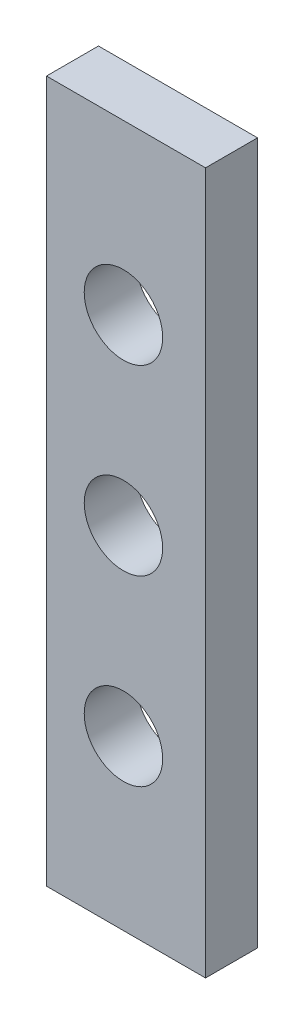
ISO-10303-21;
HEADER;
FILE_DESCRIPTION(('STEP AP214'),'2;1');
FILE_NAME('part.step','',(''),(''),'','','');
FILE_SCHEMA(('AUTOMOTIVE_DESIGN { 1 0 10303 214 1 1 1 1 }'));
ENDSEC;
DATA;
#1=APPLICATION_CONTEXT('core data for automotive mechanical design processes');
#2=APPLICATION_PROTOCOL_DEFINITION('international standard','automotive_design',2000,#1);
#3=PRODUCT_CONTEXT('',#1,'mechanical');
#4=PRODUCT('Part','Part','',(#3));
#5=PRODUCT_RELATED_PRODUCT_CATEGORY('part','',(#4));
#6=PRODUCT_DEFINITION_FORMATION('','',#4);
#7=PRODUCT_DEFINITION_CONTEXT('part definition',#1,'design');
#8=PRODUCT_DEFINITION('design','',#6,#7);
#9=PRODUCT_DEFINITION_SHAPE('','',#8);
#10=(LENGTH_UNIT() NAMED_UNIT(*) SI_UNIT(.MILLI.,.METRE.));
#11=(NAMED_UNIT(*) PLANE_ANGLE_UNIT() SI_UNIT($,.RADIAN.));
#12=(NAMED_UNIT(*) SI_UNIT($,.STERADIAN.) SOLID_ANGLE_UNIT());
#13=UNCERTAINTY_MEASURE_WITH_UNIT(LENGTH_MEASURE(1.E-05),#10,'distance_accuracy_value','');
#14=(GEOMETRIC_REPRESENTATION_CONTEXT(3) GLOBAL_UNCERTAINTY_ASSIGNED_CONTEXT((#13)) GLOBAL_UNIT_ASSIGNED_CONTEXT((#10,
#11,#12)) REPRESENTATION_CONTEXT('',''));
#15=CARTESIAN_POINT('',(0.,0.,0.));
#16=DIRECTION('',(0.,0.,1.));
#17=DIRECTION('',(1.,0.,0.));
#18=AXIS2_PLACEMENT_3D('',#15,#16,#17);
#19=CARTESIAN_POINT('',(-130.,-105.,-42.4383510177094));
#20=DIRECTION('',(1.,0.,0.));
#21=DIRECTION('',(0.,0.,1.));
#22=AXIS2_PLACEMENT_3D('',#19,#20,#21);
#23=PLANE('',#22);
#24=DIRECTION('',(0.,-1.,0.));
#25=VECTOR('',#24,1.);
#26=CARTESIAN_POINT('',(-130.,-105.,-2.85000000128499));
#27=LINE('',#26,#25);
#28=CARTESIAN_POINT('',(-130.,-66.5373864405591,-2.85000000128499));
#29=VERTEX_POINT('',#28);
#30=CARTESIAN_POINT('',(-130.,-105.,-2.85000000128499));
#31=VERTEX_POINT('',#30);
#32=EDGE_CURVE('E109',#29,#31,#27,.T.);
#33=ORIENTED_EDGE('',*,*,#32,.T.);
#34=DIRECTION('',(0.,0.,1.));
#35=VECTOR('',#34,1.);
#36=CARTESIAN_POINT('',(-130.,-105.,-42.4383510177094));
#37=LINE('',#36,#35);
#38=CARTESIAN_POINT('',(-130.,-105.,0.));
#39=VERTEX_POINT('',#38);
#40=EDGE_CURVE('E102',#31,#39,#37,.T.);
#41=ORIENTED_EDGE('',*,*,#40,.T.);
#42=DIRECTION('',(0.,-1.,0.));
#43=VECTOR('',#42,1.);
#44=CARTESIAN_POINT('',(-130.,-105.,0.));
#45=LINE('',#44,#43);
#46=CARTESIAN_POINT('',(-130.,-66.5373864405591,0.));
#47=VERTEX_POINT('',#46);
#48=EDGE_CURVE('E90',#47,#39,#45,.T.);
#49=ORIENTED_EDGE('',*,*,#48,.F.);
#50=DIRECTION('',(0.,0.,1.));
#51=VECTOR('',#50,1.);
#52=CARTESIAN_POINT('',(-130.,-66.5373864405591,-42.4383510177094));
#53=LINE('',#52,#51);
#54=EDGE_CURVE('E96',#29,#47,#53,.T.);
#55=ORIENTED_EDGE('',*,*,#54,.F.);
#56=EDGE_LOOP('',(#33,#41,#49,#55));
#57=FACE_BOUND('',#56,.T.);
#58=ADVANCED_FACE('F39',(#57),#23,.F.);
#59=CARTESIAN_POINT('',(-130.,-105.,-42.4383510177094));
#60=DIRECTION('',(0.,1.,0.));
#61=DIRECTION('',(-1.,0.,0.));
#62=AXIS2_PLACEMENT_3D('',#59,#60,#61);
#63=PLANE('',#62);
#64=DIRECTION('',(1.,0.,0.));
#65=VECTOR('',#64,1.);
#66=CARTESIAN_POINT('',(-130.,-105.,-2.85000000128499));
#67=LINE('',#66,#65);
#68=CARTESIAN_POINT('',(-121.281577604188,-105.,-2.85000000128499));
#69=VERTEX_POINT('',#68);
#70=EDGE_CURVE('E48',#31,#69,#67,.T.);
#71=ORIENTED_EDGE('',*,*,#70,.T.);
#72=DIRECTION('',(0.,0.,1.));
#73=VECTOR('',#72,1.);
#74=CARTESIAN_POINT('',(-121.281577604188,-105.,-42.4383510177094));
#75=LINE('',#74,#73);
#76=CARTESIAN_POINT('',(-121.281577604188,-105.,0.));
#77=VERTEX_POINT('',#76);
#78=EDGE_CURVE('E112',#69,#77,#75,.T.);
#79=ORIENTED_EDGE('',*,*,#78,.T.);
#80=DIRECTION('',(1.,0.,0.));
#81=VECTOR('',#80,1.);
#82=CARTESIAN_POINT('',(-130.,-105.,0.));
#83=LINE('',#82,#81);
#84=EDGE_CURVE('E79',#39,#77,#83,.T.);
#85=ORIENTED_EDGE('',*,*,#84,.F.);
#86=ORIENTED_EDGE('',*,*,#40,.F.);
#87=EDGE_LOOP('',(#71,#79,#85,#86));
#88=FACE_BOUND('',#87,.T.);
#89=ADVANCED_FACE('F146',(#88),#63,.F.);
#90=CARTESIAN_POINT('',(-121.281577604188,-105.,-42.4383510177094));
#91=DIRECTION('',(-1.,0.,0.));
#92=DIRECTION('',(0.,-1.,0.));
#93=AXIS2_PLACEMENT_3D('',#90,#91,#92);
#94=PLANE('',#93);
#95=DIRECTION('',(0.,1.,0.));
#96=VECTOR('',#95,1.);
#97=CARTESIAN_POINT('',(-121.281577604188,-105.,-2.85000000128499));
#98=LINE('',#97,#96);
#99=CARTESIAN_POINT('',(-121.281577604188,-66.5373864405591,-2.85000000128499));
#100=VERTEX_POINT('',#99);
#101=EDGE_CURVE('E11',#69,#100,#98,.T.);
#102=ORIENTED_EDGE('',*,*,#101,.T.);
#103=DIRECTION('',(0.,0.,1.));
#104=VECTOR('',#103,1.);
#105=CARTESIAN_POINT('',(-121.281577604188,-66.5373864405591,-42.4383510177094));
#106=LINE('',#105,#104);
#107=CARTESIAN_POINT('',(-121.281577604188,-66.5373864405591,0.));
#108=VERTEX_POINT('',#107);
#109=EDGE_CURVE('E94',#100,#108,#106,.T.);
#110=ORIENTED_EDGE('',*,*,#109,.T.);
#111=DIRECTION('',(0.,1.,0.));
#112=VECTOR('',#111,1.);
#113=CARTESIAN_POINT('',(-121.281577604188,-105.,0.));
#114=LINE('',#113,#112);
#115=EDGE_CURVE('E92',#77,#108,#114,.T.);
#116=ORIENTED_EDGE('',*,*,#115,.F.);
#117=ORIENTED_EDGE('',*,*,#78,.F.);
#118=EDGE_LOOP('',(#102,#110,#116,#117));
#119=FACE_BOUND('',#118,.T.);
#120=ADVANCED_FACE('F145',(#119),#94,.F.);
#121=CARTESIAN_POINT('',(-130.,-66.5373864405591,-42.4383510177094));
#122=DIRECTION('',(0.,-1.,0.));
#123=DIRECTION('',(0.,0.,1.));
#124=AXIS2_PLACEMENT_3D('',#121,#122,#123);
#125=PLANE('',#124);
#126=DIRECTION('',(-1.,0.,0.));
#127=VECTOR('',#126,1.);
#128=CARTESIAN_POINT('',(-130.,-66.5373864405591,-2.85000000128499));
#129=LINE('',#128,#127);
#130=EDGE_CURVE('E56',#100,#29,#129,.T.);
#131=ORIENTED_EDGE('',*,*,#130,.T.);
#132=ORIENTED_EDGE('',*,*,#54,.T.);
#133=DIRECTION('',(-1.,0.,0.));
#134=VECTOR('',#133,1.);
#135=CARTESIAN_POINT('',(-130.,-66.5373864405591,0.));
#136=LINE('',#135,#134);
#137=EDGE_CURVE('E62',#108,#47,#136,.T.);
#138=ORIENTED_EDGE('',*,*,#137,.F.);
#139=ORIENTED_EDGE('',*,*,#109,.F.);
#140=EDGE_LOOP('',(#131,#132,#138,#139));
#141=FACE_BOUND('',#140,.T.);
#142=ADVANCED_FACE('F97',(#141),#125,.F.);
#143=CARTESIAN_POINT('',(0.,0.,0.));
#144=DIRECTION('',(0.,0.,1.));
#145=DIRECTION('',(-1.,0.,0.));
#146=AXIS2_PLACEMENT_3D('',#143,#144,#145);
#147=PLANE('',#146);
#148=CARTESIAN_POINT('',(-125.781577604187,-95.7686932202796,0.));
#149=DIRECTION('',(0.,0.,-1.));
#150=DIRECTION('',(-1.,0.,0.));
#151=AXIS2_PLACEMENT_3D('',#148,#149,#150);
#152=CIRCLE('',#151,2.15);
#153=CARTESIAN_POINT('',(-127.931577604187,-95.7686932202796,0.));
#154=VERTEX_POINT('',#153);
#155=EDGE_CURVE('E43',#154,#154,#152,.T.);
#156=ORIENTED_EDGE('',*,*,#155,.T.);
#157=EDGE_LOOP('',(#156));
#158=FACE_BOUND('',#157,.T.);
#159=CARTESIAN_POINT('',(-125.781577604187,-85.7686932202796,0.));
#160=DIRECTION('',(0.,0.,-1.));
#161=DIRECTION('',(-1.,0.,0.));
#162=AXIS2_PLACEMENT_3D('',#159,#160,#161);
#163=CIRCLE('',#162,2.15);
#164=CARTESIAN_POINT('',(-127.931577604187,-85.7686932202796,0.));
#165=VERTEX_POINT('',#164);
#166=EDGE_CURVE('E117',#165,#165,#163,.T.);
#167=ORIENTED_EDGE('',*,*,#166,.T.);
#168=EDGE_LOOP('',(#167));
#169=FACE_BOUND('',#168,.T.);
#170=CARTESIAN_POINT('',(-125.781577604187,-75.7686932202796,0.));
#171=DIRECTION('',(0.,0.,-1.));
#172=DIRECTION('',(-1.,0.,0.));
#173=AXIS2_PLACEMENT_3D('',#170,#171,#172);
#174=CIRCLE('',#173,2.15);
#175=CARTESIAN_POINT('',(-127.931577604187,-75.7686932202796,0.));
#176=VERTEX_POINT('',#175);
#177=EDGE_CURVE('E100',#176,#176,#174,.T.);
#178=ORIENTED_EDGE('',*,*,#177,.T.);
#179=EDGE_LOOP('',(#178));
#180=FACE_BOUND('',#179,.T.);
#181=ORIENTED_EDGE('',*,*,#48,.T.);
#182=ORIENTED_EDGE('',*,*,#84,.T.);
#183=ORIENTED_EDGE('',*,*,#115,.T.);
#184=ORIENTED_EDGE('',*,*,#137,.T.);
#185=EDGE_LOOP('',(#181,#182,#183,#184));
#186=FACE_BOUND('',#185,.T.);
#187=ADVANCED_FACE('F88',(#158,#169,#180,#186),#147,.T.);
#188=CARTESIAN_POINT('',(-98.0000000000002,121.642872631566,-2.850000001285));
#189=DIRECTION('',(0.,0.,-1.));
#190=DIRECTION('',(1.,0.,0.));
#191=AXIS2_PLACEMENT_3D('',#188,#189,#190);
#192=PLANE('',#191);
#193=CARTESIAN_POINT('',(-125.781577604187,-95.7686932202796,-2.85000000128499));
#194=DIRECTION('',(0.,0.,1.));
#195=DIRECTION('',(1.,0.,0.));
#196=AXIS2_PLACEMENT_3D('',#193,#194,#195);
#197=CIRCLE('',#196,2.15);
#198=CARTESIAN_POINT('',(-123.631577604187,-95.7686932202796,-2.85000000128499));
#199=VERTEX_POINT('',#198);
#200=EDGE_CURVE('E120',#199,#199,#197,.T.);
#201=ORIENTED_EDGE('',*,*,#200,.T.);
#202=EDGE_LOOP('',(#201));
#203=FACE_BOUND('',#202,.T.);
#204=CARTESIAN_POINT('',(-125.781577604187,-85.7686932202796,-2.85000000128499));
#205=DIRECTION('',(0.,0.,1.));
#206=DIRECTION('',(1.,0.,0.));
#207=AXIS2_PLACEMENT_3D('',#204,#205,#206);
#208=CIRCLE('',#207,2.15);
#209=CARTESIAN_POINT('',(-123.631577604187,-85.7686932202796,-2.85000000128499));
#210=VERTEX_POINT('',#209);
#211=EDGE_CURVE('E118',#210,#210,#208,.T.);
#212=ORIENTED_EDGE('',*,*,#211,.T.);
#213=EDGE_LOOP('',(#212));
#214=FACE_BOUND('',#213,.T.);
#215=CARTESIAN_POINT('',(-125.781577604187,-75.7686932202796,-2.85000000128499));
#216=DIRECTION('',(0.,0.,1.));
#217=DIRECTION('',(1.,0.,0.));
#218=AXIS2_PLACEMENT_3D('',#215,#216,#217);
#219=CIRCLE('',#218,2.15);
#220=CARTESIAN_POINT('',(-123.631577604187,-75.7686932202796,-2.85000000128499));
#221=VERTEX_POINT('',#220);
#222=EDGE_CURVE('E115',#221,#221,#219,.T.);
#223=ORIENTED_EDGE('',*,*,#222,.T.);
#224=EDGE_LOOP('',(#223));
#225=FACE_BOUND('',#224,.T.);
#226=ORIENTED_EDGE('',*,*,#130,.F.);
#227=ORIENTED_EDGE('',*,*,#101,.F.);
#228=ORIENTED_EDGE('',*,*,#70,.F.);
#229=ORIENTED_EDGE('',*,*,#32,.F.);
#230=EDGE_LOOP('',(#226,#227,#228,#229));
#231=FACE_BOUND('',#230,.T.);
#232=ADVANCED_FACE('F41',(#203,#214,#225,#231),#192,.T.);
#233=CARTESIAN_POINT('',(-125.781577604187,-75.7686932202796,-7.00000000128501));
#234=DIRECTION('',(0.,0.,-1.));
#235=DIRECTION('',(1.,0.,0.));
#236=AXIS2_PLACEMENT_3D('',#233,#234,#235);
#237=CYLINDRICAL_SURFACE('',#236,2.15);
#238=ORIENTED_EDGE('',*,*,#177,.F.);
#239=EDGE_LOOP('',(#238));
#240=FACE_BOUND('',#239,.T.);
#241=ORIENTED_EDGE('',*,*,#222,.F.);
#242=EDGE_LOOP('',(#241));
#243=FACE_BOUND('',#242,.T.);
#244=ADVANCED_FACE('F135',(#240,#243),#237,.F.);
#245=CARTESIAN_POINT('',(-125.781577604187,-85.7686932202796,-7.00000000128501));
#246=DIRECTION('',(0.,0.,-1.));
#247=DIRECTION('',(1.,0.,0.));
#248=AXIS2_PLACEMENT_3D('',#245,#246,#247);
#249=CYLINDRICAL_SURFACE('',#248,2.15);
#250=ORIENTED_EDGE('',*,*,#166,.F.);
#251=EDGE_LOOP('',(#250));
#252=FACE_BOUND('',#251,.T.);
#253=ORIENTED_EDGE('',*,*,#211,.F.);
#254=EDGE_LOOP('',(#253));
#255=FACE_BOUND('',#254,.T.);
#256=ADVANCED_FACE('F138',(#252,#255),#249,.F.);
#257=CARTESIAN_POINT('',(-125.781577604187,-95.7686932202796,-7.00000000128501));
#258=DIRECTION('',(0.,0.,-1.));
#259=DIRECTION('',(1.,0.,0.));
#260=AXIS2_PLACEMENT_3D('',#257,#258,#259);
#261=CYLINDRICAL_SURFACE('',#260,2.15);
#262=ORIENTED_EDGE('',*,*,#200,.F.);
#263=EDGE_LOOP('',(#262));
#264=FACE_BOUND('',#263,.T.);
#265=ORIENTED_EDGE('',*,*,#155,.F.);
#266=EDGE_LOOP('',(#265));
#267=FACE_BOUND('',#266,.T.);
#268=ADVANCED_FACE('F162',(#264,#267),#261,.F.);
#269=CLOSED_SHELL('',(#58,#89,#120,#142,#187,#232,#244,#256,#268));
#270=MANIFOLD_SOLID_BREP('B2',#269);
#271=ADVANCED_BREP_SHAPE_REPRESENTATION('',(#18,#270),#14);
#272=SHAPE_DEFINITION_REPRESENTATION(#9,#271);
ENDSEC;
END-ISO-10303-21;
